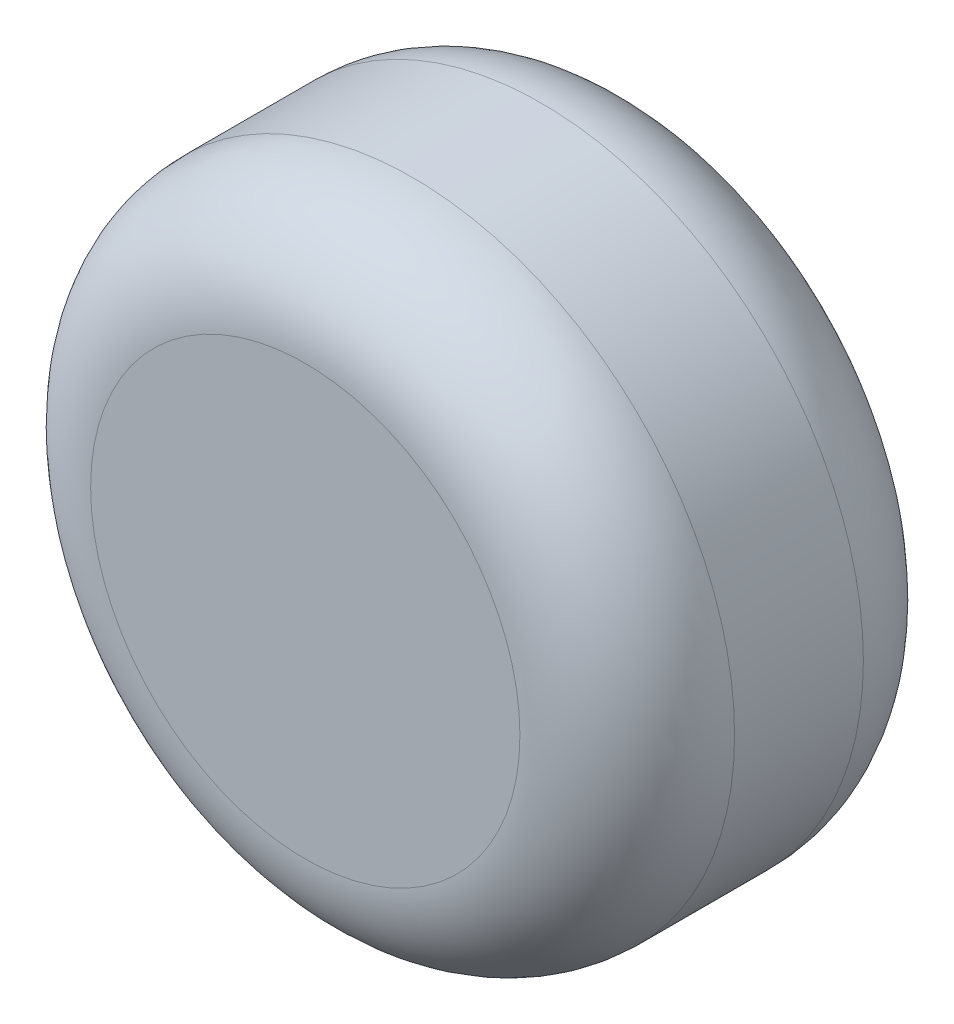
ISO-10303-21;
HEADER;
FILE_DESCRIPTION(('STEP AP214'),'2;1');
FILE_NAME('part.step','',(''),(''),'','','');
FILE_SCHEMA(('AUTOMOTIVE_DESIGN { 1 0 10303 214 1 1 1 1 }'));
ENDSEC;
DATA;
#1=APPLICATION_CONTEXT('core data for automotive mechanical design processes');
#2=APPLICATION_PROTOCOL_DEFINITION('international standard','automotive_design',2000,#1);
#3=PRODUCT_CONTEXT('',#1,'mechanical');
#4=PRODUCT('Part','Part','',(#3));
#5=PRODUCT_RELATED_PRODUCT_CATEGORY('part','',(#4));
#6=PRODUCT_DEFINITION_FORMATION('','',#4);
#7=PRODUCT_DEFINITION_CONTEXT('part definition',#1,'design');
#8=PRODUCT_DEFINITION('design','',#6,#7);
#9=PRODUCT_DEFINITION_SHAPE('','',#8);
#10=(LENGTH_UNIT() NAMED_UNIT(*) SI_UNIT(.MILLI.,.METRE.));
#11=(NAMED_UNIT(*) PLANE_ANGLE_UNIT() SI_UNIT($,.RADIAN.));
#12=(NAMED_UNIT(*) SI_UNIT($,.STERADIAN.) SOLID_ANGLE_UNIT());
#13=UNCERTAINTY_MEASURE_WITH_UNIT(LENGTH_MEASURE(1.E-05),#10,'distance_accuracy_value','');
#14=(GEOMETRIC_REPRESENTATION_CONTEXT(3) GLOBAL_UNCERTAINTY_ASSIGNED_CONTEXT((#13)) GLOBAL_UNIT_ASSIGNED_CONTEXT((#10,
#11,#12)) REPRESENTATION_CONTEXT('',''));
#15=CARTESIAN_POINT('',(0.,0.,0.));
#16=DIRECTION('',(0.,0.,1.));
#17=DIRECTION('',(1.,0.,0.));
#18=AXIS2_PLACEMENT_3D('',#15,#16,#17);
#19=CARTESIAN_POINT('',(0.,0.,0.));
#20=DIRECTION('',(0.,0.,1.));
#21=DIRECTION('',(1.,0.,0.));
#22=AXIS2_PLACEMENT_3D('',#19,#20,#21);
#23=PLANE('',#22);
#24=CARTESIAN_POINT('',(0.,0.,0.));
#25=DIRECTION('',(0.,0.,1.));
#26=DIRECTION('',(1.,0.,0.));
#27=AXIS2_PLACEMENT_3D('',#24,#25,#26);
#28=CIRCLE('',#27,20.);
#29=CARTESIAN_POINT('',(20.,0.,0.));
#30=VERTEX_POINT('',#29);
#31=EDGE_CURVE('E141',#30,#30,#28,.F.);
#32=ORIENTED_EDGE('',*,*,#31,.T.);
#33=EDGE_LOOP('',(#32));
#34=FACE_BOUND('',#33,.T.);
#35=CARTESIAN_POINT('',(0.,0.,0.));
#36=DIRECTION('',(0.,0.,1.));
#37=DIRECTION('',(1.,0.,0.));
#38=AXIS2_PLACEMENT_3D('',#35,#36,#37);
#39=CIRCLE('',#38,5.);
#40=CARTESIAN_POINT('',(5.,0.,0.));
#41=VERTEX_POINT('',#40);
#42=EDGE_CURVE('E11',#41,#41,#39,.F.);
#43=ORIENTED_EDGE('',*,*,#42,.F.);
#44=EDGE_LOOP('',(#43));
#45=FACE_BOUND('',#44,.T.);
#46=ADVANCED_FACE('F39',(#34,#45),#23,.F.);
#47=CARTESIAN_POINT('',(0.,0.,32.));
#48=DIRECTION('',(0.,0.,-1.));
#49=DIRECTION('',(-1.,0.,0.));
#50=AXIS2_PLACEMENT_3D('',#47,#48,#49);
#51=CYLINDRICAL_SURFACE('',#50,30.);
#52=CARTESIAN_POINT('',(0.,0.,10.));
#53=DIRECTION('',(0.,0.,1.));
#54=DIRECTION('',(1.,0.,0.));
#55=AXIS2_PLACEMENT_3D('',#52,#53,#54);
#56=CIRCLE('',#55,30.);
#57=CARTESIAN_POINT('',(30.,0.,10.));
#58=VERTEX_POINT('',#57);
#59=EDGE_CURVE('E137',#58,#58,#56,.T.);
#60=ORIENTED_EDGE('',*,*,#59,.T.);
#61=EDGE_LOOP('',(#60));
#62=FACE_BOUND('',#61,.T.);
#63=CARTESIAN_POINT('',(0.,0.,22.));
#64=DIRECTION('',(0.,0.,1.));
#65=DIRECTION('',(1.,0.,0.));
#66=AXIS2_PLACEMENT_3D('',#63,#64,#65);
#67=CIRCLE('',#66,30.);
#68=CARTESIAN_POINT('',(30.,0.,22.));
#69=VERTEX_POINT('',#68);
#70=EDGE_CURVE('E133',#69,#69,#67,.F.);
#71=ORIENTED_EDGE('',*,*,#70,.T.);
#72=EDGE_LOOP('',(#71));
#73=FACE_BOUND('',#72,.T.);
#74=ADVANCED_FACE('F163',(#62,#73),#51,.T.);
#75=CARTESIAN_POINT('',(0.,0.,32.));
#76=DIRECTION('',(0.,0.,1.));
#77=DIRECTION('',(1.,0.,0.));
#78=AXIS2_PLACEMENT_3D('',#75,#76,#77);
#79=PLANE('',#78);
#80=CARTESIAN_POINT('',(0.,0.,32.));
#81=DIRECTION('',(0.,0.,1.));
#82=DIRECTION('',(1.,0.,0.));
#83=AXIS2_PLACEMENT_3D('',#80,#81,#82);
#84=CIRCLE('',#83,20.);
#85=CARTESIAN_POINT('',(20.,0.,32.));
#86=VERTEX_POINT('',#85);
#87=EDGE_CURVE('E48',#86,#86,#84,.T.);
#88=ORIENTED_EDGE('',*,*,#87,.T.);
#89=EDGE_LOOP('',(#88));
#90=FACE_BOUND('',#89,.T.);
#91=ADVANCED_FACE('F148',(#90),#79,.T.);
#92=CARTESIAN_POINT('',(0.,0.,10.));
#93=DIRECTION('',(0.,0.,1.));
#94=DIRECTION('',(1.,0.,0.));
#95=AXIS2_PLACEMENT_3D('',#92,#93,#94);
#96=TOROIDAL_SURFACE('',#95,20.,10.);
#97=ORIENTED_EDGE('',*,*,#31,.F.);
#98=EDGE_LOOP('',(#97));
#99=FACE_BOUND('',#98,.T.);
#100=ORIENTED_EDGE('',*,*,#59,.F.);
#101=EDGE_LOOP('',(#100));
#102=FACE_BOUND('',#101,.T.);
#103=ADVANCED_FACE('F151',(#99,#102),#96,.T.);
#104=CARTESIAN_POINT('',(0.,0.,22.));
#105=DIRECTION('',(0.,0.,1.));
#106=DIRECTION('',(1.,0.,0.));
#107=AXIS2_PLACEMENT_3D('',#104,#105,#106);
#108=TOROIDAL_SURFACE('',#107,20.,10.);
#109=ORIENTED_EDGE('',*,*,#70,.F.);
#110=EDGE_LOOP('',(#109));
#111=FACE_BOUND('',#110,.T.);
#112=ORIENTED_EDGE('',*,*,#87,.F.);
#113=EDGE_LOOP('',(#112));
#114=FACE_BOUND('',#113,.T.);
#115=ADVANCED_FACE('F41',(#111,#114),#108,.T.);
#116=CARTESIAN_POINT('',(0.,0.,-12.));
#117=DIRECTION('',(0.,0.,-1.));
#118=DIRECTION('',(-1.,0.,0.));
#119=AXIS2_PLACEMENT_3D('',#116,#117,#118);
#120=PLANE('',#119);
#121=CARTESIAN_POINT('',(0.,0.,-12.));
#122=DIRECTION('',(0.,0.,-1.));
#123=DIRECTION('',(-1.,0.,0.));
#124=AXIS2_PLACEMENT_3D('',#121,#122,#123);
#125=CIRCLE('',#124,5.);
#126=CARTESIAN_POINT('',(-5.,0.,-12.));
#127=VERTEX_POINT('',#126);
#128=EDGE_CURVE('E98',#127,#127,#125,.T.);
#129=ORIENTED_EDGE('',*,*,#128,.T.);
#130=EDGE_LOOP('',(#129));
#131=FACE_BOUND('',#130,.T.);
#132=DIRECTION('',(-1.,0.,0.));
#133=VECTOR('',#132,1.);
#134=CARTESIAN_POINT('',(1.19895788082818,-2.75,-12.));
#135=LINE('',#134,#133);
#136=CARTESIAN_POINT('',(1.19895788082818,-2.75,-12.));
#137=VERTEX_POINT('',#136);
#138=CARTESIAN_POINT('',(-1.19895788082818,-2.75,-12.));
#139=VERTEX_POINT('',#138);
#140=EDGE_CURVE('E89',#137,#139,#135,.T.);
#141=ORIENTED_EDGE('',*,*,#140,.F.);
#142=CARTESIAN_POINT('',(0.,0.,-12.));
#143=DIRECTION('',(0.,0.,-1.));
#144=DIRECTION('',(-1.,0.,0.));
#145=AXIS2_PLACEMENT_3D('',#142,#143,#144);
#146=CIRCLE('',#145,3.);
#147=CARTESIAN_POINT('',(1.19895788082818,2.75,-12.));
#148=VERTEX_POINT('',#147);
#149=EDGE_CURVE('E80',#148,#137,#146,.T.);
#150=ORIENTED_EDGE('',*,*,#149,.F.);
#151=DIRECTION('',(1.,0.,0.));
#152=VECTOR('',#151,1.);
#153=CARTESIAN_POINT('',(1.19895788082818,2.75,-12.));
#154=LINE('',#153,#152);
#155=CARTESIAN_POINT('',(-1.19895788082818,2.75,-12.));
#156=VERTEX_POINT('',#155);
#157=EDGE_CURVE('E107',#156,#148,#154,.T.);
#158=ORIENTED_EDGE('',*,*,#157,.F.);
#159=CARTESIAN_POINT('',(0.,0.,-12.));
#160=DIRECTION('',(0.,0.,-1.));
#161=DIRECTION('',(-1.,0.,0.));
#162=AXIS2_PLACEMENT_3D('',#159,#160,#161);
#163=CIRCLE('',#162,3.);
#164=EDGE_CURVE('E103',#139,#156,#163,.T.);
#165=ORIENTED_EDGE('',*,*,#164,.F.);
#166=EDGE_LOOP('',(#141,#150,#158,#165));
#167=FACE_BOUND('',#166,.T.);
#168=ADVANCED_FACE('F102',(#131,#167),#120,.T.);
#169=CARTESIAN_POINT('',(0.,0.,-12.));
#170=DIRECTION('',(0.,0.,1.));
#171=DIRECTION('',(1.,0.,0.));
#172=AXIS2_PLACEMENT_3D('',#169,#170,#171);
#173=CYLINDRICAL_SURFACE('',#172,5.);
#174=ORIENTED_EDGE('',*,*,#128,.F.);
#175=EDGE_LOOP('',(#174));
#176=FACE_BOUND('',#175,.T.);
#177=ORIENTED_EDGE('',*,*,#42,.T.);
#178=EDGE_LOOP('',(#177));
#179=FACE_BOUND('',#178,.T.);
#180=ADVANCED_FACE('F157',(#176,#179),#173,.T.);
#181=CARTESIAN_POINT('',(0.,0.,-12.));
#182=DIRECTION('',(0.,0.,1.));
#183=DIRECTION('',(1.,0.,0.));
#184=AXIS2_PLACEMENT_3D('',#181,#182,#183);
#185=CYLINDRICAL_SURFACE('',#184,3.);
#186=CARTESIAN_POINT('',(0.,0.,0.));
#187=DIRECTION('',(0.,0.,-1.));
#188=DIRECTION('',(-1.,0.,0.));
#189=AXIS2_PLACEMENT_3D('',#186,#187,#188);
#190=CIRCLE('',#189,3.);
#191=CARTESIAN_POINT('',(1.19895788082818,2.75,0.));
#192=VERTEX_POINT('',#191);
#193=CARTESIAN_POINT('',(1.19895788082818,-2.75,0.));
#194=VERTEX_POINT('',#193);
#195=EDGE_CURVE('E112',#192,#194,#190,.T.);
#196=ORIENTED_EDGE('',*,*,#195,.F.);
#197=DIRECTION('',(0.,0.,1.));
#198=VECTOR('',#197,1.);
#199=CARTESIAN_POINT('',(1.19895788082818,2.75,-12.));
#200=LINE('',#199,#198);
#201=EDGE_CURVE('E55',#148,#192,#200,.T.);
#202=ORIENTED_EDGE('',*,*,#201,.F.);
#203=ORIENTED_EDGE('',*,*,#149,.T.);
#204=DIRECTION('',(0.,0.,1.));
#205=VECTOR('',#204,1.);
#206=CARTESIAN_POINT('',(1.19895788082818,-2.75,-12.));
#207=LINE('',#206,#205);
#208=EDGE_CURVE('E83',#137,#194,#207,.T.);
#209=ORIENTED_EDGE('',*,*,#208,.T.);
#210=EDGE_LOOP('',(#196,#202,#203,#209));
#211=FACE_BOUND('',#210,.T.);
#212=ADVANCED_FACE('F82',(#211),#185,.F.);
#213=CARTESIAN_POINT('',(1.19895788082818,-2.75,-12.));
#214=DIRECTION('',(0.,1.,0.));
#215=DIRECTION('',(0.,0.,1.));
#216=AXIS2_PLACEMENT_3D('',#213,#214,#215);
#217=PLANE('',#216);
#218=DIRECTION('',(-1.,0.,0.));
#219=VECTOR('',#218,1.);
#220=CARTESIAN_POINT('',(1.19895788082818,-2.75,0.));
#221=LINE('',#220,#219);
#222=CARTESIAN_POINT('',(-1.19895788082818,-2.75,0.));
#223=VERTEX_POINT('',#222);
#224=EDGE_CURVE('E96',#194,#223,#221,.T.);
#225=ORIENTED_EDGE('',*,*,#224,.F.);
#226=ORIENTED_EDGE('',*,*,#208,.F.);
#227=ORIENTED_EDGE('',*,*,#140,.T.);
#228=DIRECTION('',(0.,0.,1.));
#229=VECTOR('',#228,1.);
#230=CARTESIAN_POINT('',(-1.19895788082818,-2.75,-12.));
#231=LINE('',#230,#229);
#232=EDGE_CURVE('E99',#139,#223,#231,.T.);
#233=ORIENTED_EDGE('',*,*,#232,.T.);
#234=EDGE_LOOP('',(#225,#226,#227,#233));
#235=FACE_BOUND('',#234,.T.);
#236=ADVANCED_FACE('F93',(#235),#217,.T.);
#237=CARTESIAN_POINT('',(0.,0.,-12.));
#238=DIRECTION('',(0.,0.,1.));
#239=DIRECTION('',(1.,0.,0.));
#240=AXIS2_PLACEMENT_3D('',#237,#238,#239);
#241=CYLINDRICAL_SURFACE('',#240,3.);
#242=CARTESIAN_POINT('',(0.,0.,0.));
#243=DIRECTION('',(0.,0.,-1.));
#244=DIRECTION('',(-1.,0.,0.));
#245=AXIS2_PLACEMENT_3D('',#242,#243,#244);
#246=CIRCLE('',#245,3.);
#247=CARTESIAN_POINT('',(-1.19895788082818,2.75,0.));
#248=VERTEX_POINT('',#247);
#249=EDGE_CURVE('E117',#223,#248,#246,.T.);
#250=ORIENTED_EDGE('',*,*,#249,.F.);
#251=ORIENTED_EDGE('',*,*,#232,.F.);
#252=ORIENTED_EDGE('',*,*,#164,.T.);
#253=DIRECTION('',(0.,0.,1.));
#254=VECTOR('',#253,1.);
#255=CARTESIAN_POINT('',(-1.19895788082818,2.75,-12.));
#256=LINE('',#255,#254);
#257=EDGE_CURVE('E60',#156,#248,#256,.T.);
#258=ORIENTED_EDGE('',*,*,#257,.T.);
#259=EDGE_LOOP('',(#250,#251,#252,#258));
#260=FACE_BOUND('',#259,.T.);
#261=ADVANCED_FACE('F180',(#260),#241,.F.);
#262=CARTESIAN_POINT('',(1.19895788082818,2.75,-12.));
#263=DIRECTION('',(0.,-1.,0.));
#264=DIRECTION('',(0.,0.,-1.));
#265=AXIS2_PLACEMENT_3D('',#262,#263,#264);
#266=PLANE('',#265);
#267=DIRECTION('',(1.,0.,0.));
#268=VECTOR('',#267,1.);
#269=CARTESIAN_POINT('',(1.19895788082818,2.75,0.));
#270=LINE('',#269,#268);
#271=EDGE_CURVE('E90',#248,#192,#270,.T.);
#272=ORIENTED_EDGE('',*,*,#271,.F.);
#273=ORIENTED_EDGE('',*,*,#257,.F.);
#274=ORIENTED_EDGE('',*,*,#157,.T.);
#275=ORIENTED_EDGE('',*,*,#201,.T.);
#276=EDGE_LOOP('',(#272,#273,#274,#275));
#277=FACE_BOUND('',#276,.T.);
#278=ADVANCED_FACE('F175',(#277),#266,.T.);
#279=ORIENTED_EDGE('',*,*,#271,.T.);
#280=ORIENTED_EDGE('',*,*,#195,.T.);
#281=ORIENTED_EDGE('',*,*,#224,.T.);
#282=ORIENTED_EDGE('',*,*,#249,.T.);
#283=EDGE_LOOP('',(#279,#280,#281,#282));
#284=FACE_BOUND('',#283,.T.);
#285=ADVANCED_FACE('F166',(#284),#23,.F.);
#286=CLOSED_SHELL('',(#46,#74,#91,#103,#115,#168,#180,#212,#236,#261,#278,#285));
#287=MANIFOLD_SOLID_BREP('B2',#286);
#288=ADVANCED_BREP_SHAPE_REPRESENTATION('',(#18,#287),#14);
#289=SHAPE_DEFINITION_REPRESENTATION(#9,#288);
ENDSEC;
END-ISO-10303-21;
